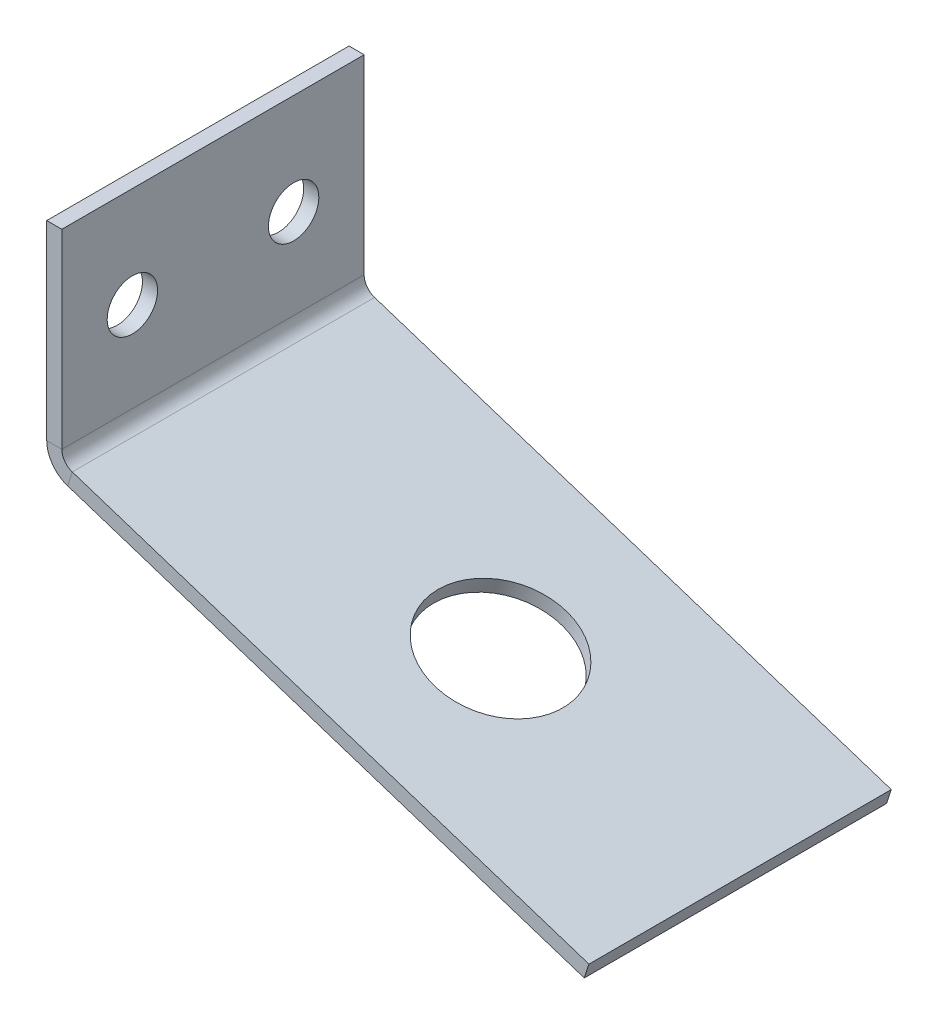
ISO-10303-21;
HEADER;
FILE_DESCRIPTION(('STEP AP214'),'2;1');
FILE_NAME('part.step','',(''),(''),'','','');
FILE_SCHEMA(('AUTOMOTIVE_DESIGN { 1 0 10303 214 1 1 1 1 }'));
ENDSEC;
DATA;
#1=APPLICATION_CONTEXT('core data for automotive mechanical design processes');
#2=APPLICATION_PROTOCOL_DEFINITION('international standard','automotive_design',2000,#1);
#3=PRODUCT_CONTEXT('',#1,'mechanical');
#4=PRODUCT('Part','Part','',(#3));
#5=PRODUCT_RELATED_PRODUCT_CATEGORY('part','',(#4));
#6=PRODUCT_DEFINITION_FORMATION('','',#4);
#7=PRODUCT_DEFINITION_CONTEXT('part definition',#1,'design');
#8=PRODUCT_DEFINITION('design','',#6,#7);
#9=PRODUCT_DEFINITION_SHAPE('','',#8);
#10=(LENGTH_UNIT() NAMED_UNIT(*) SI_UNIT(.MILLI.,.METRE.));
#11=(NAMED_UNIT(*) PLANE_ANGLE_UNIT() SI_UNIT($,.RADIAN.));
#12=(NAMED_UNIT(*) SI_UNIT($,.STERADIAN.) SOLID_ANGLE_UNIT());
#13=UNCERTAINTY_MEASURE_WITH_UNIT(LENGTH_MEASURE(1.E-05),#10,'distance_accuracy_value','');
#14=(GEOMETRIC_REPRESENTATION_CONTEXT(3) GLOBAL_UNCERTAINTY_ASSIGNED_CONTEXT((#13)) GLOBAL_UNIT_ASSIGNED_CONTEXT((#10,
#11,#12)) REPRESENTATION_CONTEXT('',''));
#15=CARTESIAN_POINT('',(0.,0.,0.));
#16=DIRECTION('',(0.,0.,1.));
#17=DIRECTION('',(1.,0.,0.));
#18=AXIS2_PLACEMENT_3D('',#15,#16,#17);
#19=CARTESIAN_POINT('',(1.03647450843758,-0.336770982434687,15.));
#20=DIRECTION('',(0.,0.,1.));
#21=DIRECTION('',(1.,0.,0.));
#22=AXIS2_PLACEMENT_3D('',#19,#20,#21);
#23=PLANE('',#22);
#24=DIRECTION('',(-0.309016994374944,-0.951056516295155,0.));
#25=VECTOR('',#24,1.);
#26=CARTESIAN_POINT('',(1.03647450843758,-0.336770982434687,15.));
#27=LINE('',#26,#25);
#28=CARTESIAN_POINT('',(1.03647450843758,-0.336770982434687,15.));
#29=VERTEX_POINT('',#28);
#30=CARTESIAN_POINT('',(0.572949016875167,-1.76335575687742,15.));
#31=VERTEX_POINT('',#30);
#32=EDGE_CURVE('E11',#29,#31,#27,.T.);
#33=ORIENTED_EDGE('',*,*,#32,.F.);
#34=CARTESIAN_POINT('',(1.5,1.08981379200804,15.));
#35=DIRECTION('',(0.,0.,-1.));
#36=DIRECTION('',(-1.,0.,0.));
#37=AXIS2_PLACEMENT_3D('',#34,#35,#36);
#38=CIRCLE('',#37,1.5);
#39=CARTESIAN_POINT('',(0.,1.08981379200804,15.));
#40=VERTEX_POINT('',#39);
#41=EDGE_CURVE('E142',#40,#29,#38,.F.);
#42=ORIENTED_EDGE('',*,*,#41,.F.);
#43=DIRECTION('',(1.,0.,0.));
#44=VECTOR('',#43,1.);
#45=CARTESIAN_POINT('',(-1.5,1.08981379200804,15.));
#46=LINE('',#45,#44);
#47=CARTESIAN_POINT('',(-1.5,1.08981379200804,15.));
#48=VERTEX_POINT('',#47);
#49=EDGE_CURVE('E53',#48,#40,#46,.T.);
#50=ORIENTED_EDGE('',*,*,#49,.F.);
#51=CARTESIAN_POINT('',(1.5,1.08981379200804,15.));
#52=DIRECTION('',(0.,0.,1.));
#53=DIRECTION('',(1.,0.,0.));
#54=AXIS2_PLACEMENT_3D('',#51,#52,#53);
#55=CIRCLE('',#54,3.);
#56=EDGE_CURVE('E135',#48,#31,#55,.T.);
#57=ORIENTED_EDGE('',*,*,#56,.T.);
#58=EDGE_LOOP('',(#33,#42,#50,#57));
#59=FACE_BOUND('',#58,.T.);
#60=ADVANCED_FACE('F45',(#59),#23,.T.);
#61=CARTESIAN_POINT('',(-1.5,1.08981379200804,15.));
#62=DIRECTION('',(0.,0.,1.));
#63=DIRECTION('',(1.,0.,0.));
#64=AXIS2_PLACEMENT_3D('',#61,#62,#63);
#65=PLANE('',#64);
#66=DIRECTION('',(0.951056516295155,-0.309016994374945,0.));
#67=VECTOR('',#66,1.);
#68=CARTESIAN_POINT('',(0.,0.,15.));
#69=LINE('',#68,#67);
#70=CARTESIAN_POINT('',(52.3081083962335,-16.995934690622,15.));
#71=VERTEX_POINT('',#70);
#72=EDGE_CURVE('E192',#29,#71,#69,.T.);
#73=ORIENTED_EDGE('',*,*,#72,.F.);
#74=ORIENTED_EDGE('',*,*,#32,.T.);
#75=DIRECTION('',(0.951056516295155,-0.309016994374945,0.));
#76=VECTOR('',#75,1.);
#77=CARTESIAN_POINT('',(-0.463525491562417,-1.42658477444273,15.));
#78=LINE('',#77,#76);
#79=CARTESIAN_POINT('',(51.8445829046711,-18.4225194650647,15.));
#80=VERTEX_POINT('',#79);
#81=EDGE_CURVE('E101',#31,#80,#78,.T.);
#82=ORIENTED_EDGE('',*,*,#81,.T.);
#83=DIRECTION('',(-0.309016994374934,-0.951056516295158,0.));
#84=VECTOR('',#83,1.);
#85=CARTESIAN_POINT('',(52.3081083962335,-16.995934690622,15.));
#86=LINE('',#85,#84);
#87=EDGE_CURVE('E406',#71,#80,#86,.T.);
#88=ORIENTED_EDGE('',*,*,#87,.F.);
#89=EDGE_LOOP('',(#73,#74,#82,#88));
#90=FACE_BOUND('',#89,.T.);
#91=ADVANCED_FACE('F200',(#90),#65,.T.);
#92=CARTESIAN_POINT('',(0.,1.08981379200804,-15.));
#93=DIRECTION('',(0.,0.,-1.));
#94=DIRECTION('',(-1.,0.,0.));
#95=AXIS2_PLACEMENT_3D('',#92,#93,#94);
#96=PLANE('',#95);
#97=DIRECTION('',(-1.,0.,0.));
#98=VECTOR('',#97,1.);
#99=CARTESIAN_POINT('',(0.,1.08981379200804,-15.));
#100=LINE('',#99,#98);
#101=CARTESIAN_POINT('',(0.,1.08981379200804,-15.));
#102=VERTEX_POINT('',#101);
#103=CARTESIAN_POINT('',(-1.5,1.08981379200804,-15.));
#104=VERTEX_POINT('',#103);
#105=EDGE_CURVE('E88',#102,#104,#100,.T.);
#106=ORIENTED_EDGE('',*,*,#105,.F.);
#107=CARTESIAN_POINT('',(1.5,1.08981379200804,-15.));
#108=DIRECTION('',(0.,0.,-1.));
#109=DIRECTION('',(-1.,0.,0.));
#110=AXIS2_PLACEMENT_3D('',#107,#108,#109);
#111=CIRCLE('',#110,1.5);
#112=CARTESIAN_POINT('',(1.03647450843758,-0.336770982434687,-15.));
#113=VERTEX_POINT('',#112);
#114=EDGE_CURVE('E158',#102,#113,#111,.F.);
#115=ORIENTED_EDGE('',*,*,#114,.T.);
#116=DIRECTION('',(0.309016994374944,0.951056516295155,0.));
#117=VECTOR('',#116,1.);
#118=CARTESIAN_POINT('',(0.572949016875167,-1.76335575687742,-15.));
#119=LINE('',#118,#117);
#120=CARTESIAN_POINT('',(0.572949016875167,-1.76335575687742,-15.));
#121=VERTEX_POINT('',#120);
#122=EDGE_CURVE('E95',#121,#113,#119,.T.);
#123=ORIENTED_EDGE('',*,*,#122,.F.);
#124=CARTESIAN_POINT('',(1.5,1.08981379200804,-15.));
#125=DIRECTION('',(0.,0.,1.));
#126=DIRECTION('',(1.,0.,0.));
#127=AXIS2_PLACEMENT_3D('',#124,#125,#126);
#128=CIRCLE('',#127,3.);
#129=EDGE_CURVE('E165',#104,#121,#128,.T.);
#130=ORIENTED_EDGE('',*,*,#129,.F.);
#131=EDGE_LOOP('',(#106,#115,#123,#130));
#132=FACE_BOUND('',#131,.T.);
#133=ADVANCED_FACE('F198',(#132),#96,.T.);
#134=CARTESIAN_POINT('',(0.572949016875167,-1.76335575687742,-15.));
#135=DIRECTION('',(0.,0.,-1.));
#136=DIRECTION('',(-1.,0.,0.));
#137=AXIS2_PLACEMENT_3D('',#134,#135,#136);
#138=PLANE('',#137);
#139=DIRECTION('',(0.,-1.,0.));
#140=VECTOR('',#139,1.);
#141=CARTESIAN_POINT('',(0.,20.,-15.));
#142=LINE('',#141,#140);
#143=CARTESIAN_POINT('',(0.,20.,-15.));
#144=VERTEX_POINT('',#143);
#145=EDGE_CURVE('E160',#144,#102,#142,.T.);
#146=ORIENTED_EDGE('',*,*,#145,.T.);
#147=ORIENTED_EDGE('',*,*,#105,.T.);
#148=DIRECTION('',(0.,-1.,0.));
#149=VECTOR('',#148,1.);
#150=CARTESIAN_POINT('',(-1.5,20.,-15.));
#151=LINE('',#150,#149);
#152=CARTESIAN_POINT('',(-1.5,20.,-15.));
#153=VERTEX_POINT('',#152);
#154=EDGE_CURVE('E163',#153,#104,#151,.T.);
#155=ORIENTED_EDGE('',*,*,#154,.F.);
#156=DIRECTION('',(1.,0.,0.));
#157=VECTOR('',#156,1.);
#158=CARTESIAN_POINT('',(-1.5,20.,-15.));
#159=LINE('',#158,#157);
#160=EDGE_CURVE('E123',#153,#144,#159,.T.);
#161=ORIENTED_EDGE('',*,*,#160,.T.);
#162=EDGE_LOOP('',(#146,#147,#155,#161));
#163=FACE_BOUND('',#162,.T.);
#164=ADVANCED_FACE('F194',(#163),#138,.T.);
#165=CARTESIAN_POINT('',(-0.463525491562417,-1.42658477444273,15.));
#166=DIRECTION('',(0.309016994374945,0.951056516295154,0.));
#167=DIRECTION('',(-0.951056516295155,0.309016994374945,0.));
#168=AXIS2_PLACEMENT_3D('',#165,#166,#167);
#169=PLANE('',#168);
#170=CARTESIAN_POINT('',(28.0681699972922,-10.6970946056911,0.));
#171=DIRECTION('',(0.309016994374945,0.951056516295155,0.));
#172=DIRECTION('',(-0.951056516295155,0.309016994374945,0.));
#173=AXIS2_PLACEMENT_3D('',#170,#171,#172);
#174=CIRCLE('',#173,6.5);
#175=CARTESIAN_POINT('',(21.8863026413737,-8.68848414225393,0.));
#176=VERTEX_POINT('',#175);
#177=EDGE_CURVE('E387',#176,#176,#174,.T.);
#178=ORIENTED_EDGE('',*,*,#177,.T.);
#179=EDGE_LOOP('',(#178));
#180=FACE_BOUND('',#179,.T.);
#181=DIRECTION('',(0.951056516295155,-0.309016994374945,0.));
#182=VECTOR('',#181,1.);
#183=CARTESIAN_POINT('',(-0.463525491562417,-1.42658477444273,-15.));
#184=LINE('',#183,#182);
#185=CARTESIAN_POINT('',(51.8445829046711,-18.4225194650647,-15.));
#186=VERTEX_POINT('',#185);
#187=EDGE_CURVE('E148',#121,#186,#184,.T.);
#188=ORIENTED_EDGE('',*,*,#187,.T.);
#189=DIRECTION('',(0.,0.,-1.));
#190=VECTOR('',#189,1.);
#191=CARTESIAN_POINT('',(51.8445829046711,-18.4225194650647,15.));
#192=LINE('',#191,#190);
#193=EDGE_CURVE('E179',#80,#186,#192,.T.);
#194=ORIENTED_EDGE('',*,*,#193,.F.);
#195=ORIENTED_EDGE('',*,*,#81,.F.);
#196=DIRECTION('',(0.,0.,-1.));
#197=VECTOR('',#196,1.);
#198=CARTESIAN_POINT('',(0.572949016875167,-1.76335575687742,15.));
#199=LINE('',#198,#197);
#200=EDGE_CURVE('E147',#31,#121,#199,.T.);
#201=ORIENTED_EDGE('',*,*,#200,.T.);
#202=EDGE_LOOP('',(#188,#194,#195,#201));
#203=FACE_BOUND('',#202,.T.);
#204=ADVANCED_FACE('F206',(#180,#203),#169,.F.);
#205=CARTESIAN_POINT('',(52.3081083962335,-16.995934690622,15.));
#206=DIRECTION('',(0.951056516295158,-0.309016994374934,0.));
#207=DIRECTION('',(0.309016994374934,0.951056516295158,0.));
#208=AXIS2_PLACEMENT_3D('',#205,#206,#207);
#209=PLANE('',#208);
#210=DIRECTION('',(-0.309016994374934,-0.951056516295158,0.));
#211=VECTOR('',#210,1.);
#212=CARTESIAN_POINT('',(52.3081083962335,-16.995934690622,-15.));
#213=LINE('',#212,#211);
#214=CARTESIAN_POINT('',(52.3081083962335,-16.995934690622,-15.));
#215=VERTEX_POINT('',#214);
#216=EDGE_CURVE('E151',#215,#186,#213,.T.);
#217=ORIENTED_EDGE('',*,*,#216,.F.);
#218=DIRECTION('',(0.,0.,-1.));
#219=VECTOR('',#218,1.);
#220=CARTESIAN_POINT('',(52.3081083962335,-16.995934690622,15.));
#221=LINE('',#220,#219);
#222=EDGE_CURVE('E177',#71,#215,#221,.T.);
#223=ORIENTED_EDGE('',*,*,#222,.F.);
#224=ORIENTED_EDGE('',*,*,#87,.T.);
#225=ORIENTED_EDGE('',*,*,#193,.T.);
#226=EDGE_LOOP('',(#217,#223,#224,#225));
#227=FACE_BOUND('',#226,.T.);
#228=ADVANCED_FACE('F240',(#227),#209,.T.);
#229=CARTESIAN_POINT('',(0.,0.,15.));
#230=DIRECTION('',(0.309016994374945,0.951056516295155,0.));
#231=DIRECTION('',(-0.951056516295155,0.309016994374945,0.));
#232=AXIS2_PLACEMENT_3D('',#229,#230,#231);
#233=PLANE('',#232);
#234=CARTESIAN_POINT('',(28.5316954888546,-9.27050983124834,0.));
#235=DIRECTION('',(0.309016994374945,0.951056516295155,0.));
#236=DIRECTION('',(-0.951056516295155,0.309016994374945,0.));
#237=AXIS2_PLACEMENT_3D('',#234,#235,#236);
#238=CIRCLE('',#237,6.5);
#239=CARTESIAN_POINT('',(22.3498281329361,-7.2618993678112,0.));
#240=VERTEX_POINT('',#239);
#241=EDGE_CURVE('E390',#240,#240,#238,.T.);
#242=ORIENTED_EDGE('',*,*,#241,.F.);
#243=EDGE_LOOP('',(#242));
#244=FACE_BOUND('',#243,.T.);
#245=DIRECTION('',(0.951056516295155,-0.309016994374945,0.));
#246=VECTOR('',#245,1.);
#247=CARTESIAN_POINT('',(0.,0.,-15.));
#248=LINE('',#247,#246);
#249=EDGE_CURVE('E155',#113,#215,#248,.T.);
#250=ORIENTED_EDGE('',*,*,#249,.F.);
#251=DIRECTION('',(0.,0.,-1.));
#252=VECTOR('',#251,1.);
#253=CARTESIAN_POINT('',(1.03647450843758,-0.336770982434687,15.));
#254=LINE('',#253,#252);
#255=EDGE_CURVE('E174',#29,#113,#254,.T.);
#256=ORIENTED_EDGE('',*,*,#255,.F.);
#257=ORIENTED_EDGE('',*,*,#72,.T.);
#258=ORIENTED_EDGE('',*,*,#222,.T.);
#259=EDGE_LOOP('',(#250,#256,#257,#258));
#260=FACE_BOUND('',#259,.T.);
#261=ADVANCED_FACE('F252',(#244,#260),#233,.T.);
#262=CARTESIAN_POINT('',(1.5,1.08981379200804,15.));
#263=DIRECTION('',(0.,0.,-1.));
#264=DIRECTION('',(-1.,0.,0.));
#265=AXIS2_PLACEMENT_3D('',#262,#263,#264);
#266=CYLINDRICAL_SURFACE('',#265,1.5);
#267=ORIENTED_EDGE('',*,*,#114,.F.);
#268=DIRECTION('',(0.,0.,-1.));
#269=VECTOR('',#268,1.);
#270=CARTESIAN_POINT('',(0.,1.08981379200804,15.));
#271=LINE('',#270,#269);
#272=EDGE_CURVE('E171',#40,#102,#271,.T.);
#273=ORIENTED_EDGE('',*,*,#272,.F.);
#274=ORIENTED_EDGE('',*,*,#41,.T.);
#275=ORIENTED_EDGE('',*,*,#255,.T.);
#276=EDGE_LOOP('',(#267,#273,#274,#275));
#277=FACE_BOUND('',#276,.T.);
#278=ADVANCED_FACE('F188',(#277),#266,.F.);
#279=CARTESIAN_POINT('',(0.,20.,15.));
#280=DIRECTION('',(1.,0.,0.));
#281=DIRECTION('',(0.,1.,0.));
#282=AXIS2_PLACEMENT_3D('',#279,#280,#281);
#283=PLANE('',#282);
#284=CARTESIAN_POINT('',(0.,10.,8.));
#285=DIRECTION('',(1.,0.,0.));
#286=DIRECTION('',(0.,1.,0.));
#287=AXIS2_PLACEMENT_3D('',#284,#285,#286);
#288=CIRCLE('',#287,2.5);
#289=CARTESIAN_POINT('',(0.,12.5,8.));
#290=VERTEX_POINT('',#289);
#291=EDGE_CURVE('E397',#290,#290,#288,.T.);
#292=ORIENTED_EDGE('',*,*,#291,.F.);
#293=EDGE_LOOP('',(#292));
#294=FACE_BOUND('',#293,.T.);
#295=CARTESIAN_POINT('',(0.,10.,-8.));
#296=DIRECTION('',(1.,0.,0.));
#297=DIRECTION('',(0.,1.,0.));
#298=AXIS2_PLACEMENT_3D('',#295,#296,#297);
#299=CIRCLE('',#298,2.5);
#300=CARTESIAN_POINT('',(0.,12.5,-8.));
#301=VERTEX_POINT('',#300);
#302=EDGE_CURVE('E392',#301,#301,#299,.T.);
#303=ORIENTED_EDGE('',*,*,#302,.F.);
#304=EDGE_LOOP('',(#303));
#305=FACE_BOUND('',#304,.T.);
#306=ORIENTED_EDGE('',*,*,#145,.F.);
#307=DIRECTION('',(0.,0.,-1.));
#308=VECTOR('',#307,1.);
#309=CARTESIAN_POINT('',(0.,20.,15.));
#310=LINE('',#309,#308);
#311=CARTESIAN_POINT('',(0.,20.,15.));
#312=VERTEX_POINT('',#311);
#313=EDGE_CURVE('E125',#312,#144,#310,.T.);
#314=ORIENTED_EDGE('',*,*,#313,.F.);
#315=DIRECTION('',(0.,-1.,0.));
#316=VECTOR('',#315,1.);
#317=CARTESIAN_POINT('',(0.,20.,15.));
#318=LINE('',#317,#316);
#319=EDGE_CURVE('E140',#312,#40,#318,.T.);
#320=ORIENTED_EDGE('',*,*,#319,.T.);
#321=ORIENTED_EDGE('',*,*,#272,.T.);
#322=EDGE_LOOP('',(#306,#314,#320,#321));
#323=FACE_BOUND('',#322,.T.);
#324=ADVANCED_FACE('F193',(#294,#305,#323),#283,.T.);
#325=CARTESIAN_POINT('',(-1.5,20.,15.));
#326=DIRECTION('',(0.,1.,0.));
#327=DIRECTION('',(0.,0.,1.));
#328=AXIS2_PLACEMENT_3D('',#325,#326,#327);
#329=PLANE('',#328);
#330=ORIENTED_EDGE('',*,*,#160,.F.);
#331=DIRECTION('',(0.,0.,-1.));
#332=VECTOR('',#331,1.);
#333=CARTESIAN_POINT('',(-1.5,20.,15.));
#334=LINE('',#333,#332);
#335=CARTESIAN_POINT('',(-1.5,20.,15.));
#336=VERTEX_POINT('',#335);
#337=EDGE_CURVE('E117',#336,#153,#334,.T.);
#338=ORIENTED_EDGE('',*,*,#337,.F.);
#339=DIRECTION('',(1.,0.,0.));
#340=VECTOR('',#339,1.);
#341=CARTESIAN_POINT('',(-1.5,20.,15.));
#342=LINE('',#341,#340);
#343=EDGE_CURVE('E121',#336,#312,#342,.T.);
#344=ORIENTED_EDGE('',*,*,#343,.T.);
#345=ORIENTED_EDGE('',*,*,#313,.T.);
#346=EDGE_LOOP('',(#330,#338,#344,#345));
#347=FACE_BOUND('',#346,.T.);
#348=ADVANCED_FACE('F119',(#347),#329,.T.);
#349=CARTESIAN_POINT('',(-1.5,20.,15.));
#350=DIRECTION('',(1.,0.,0.));
#351=DIRECTION('',(0.,1.,0.));
#352=AXIS2_PLACEMENT_3D('',#349,#350,#351);
#353=PLANE('',#352);
#354=CARTESIAN_POINT('',(-1.5,10.,8.));
#355=DIRECTION('',(1.,0.,0.));
#356=DIRECTION('',(0.,1.,0.));
#357=AXIS2_PLACEMENT_3D('',#354,#355,#356);
#358=CIRCLE('',#357,2.5);
#359=CARTESIAN_POINT('',(-1.5,12.5,8.));
#360=VERTEX_POINT('',#359);
#361=EDGE_CURVE('E152',#360,#360,#358,.T.);
#362=ORIENTED_EDGE('',*,*,#361,.T.);
#363=EDGE_LOOP('',(#362));
#364=FACE_BOUND('',#363,.T.);
#365=CARTESIAN_POINT('',(-1.5,10.,-8.));
#366=DIRECTION('',(1.,0.,0.));
#367=DIRECTION('',(0.,1.,0.));
#368=AXIS2_PLACEMENT_3D('',#365,#366,#367);
#369=CIRCLE('',#368,2.5);
#370=CARTESIAN_POINT('',(-1.5,12.5,-8.));
#371=VERTEX_POINT('',#370);
#372=EDGE_CURVE('E400',#371,#371,#369,.T.);
#373=ORIENTED_EDGE('',*,*,#372,.T.);
#374=EDGE_LOOP('',(#373));
#375=FACE_BOUND('',#374,.T.);
#376=ORIENTED_EDGE('',*,*,#154,.T.);
#377=DIRECTION('',(0.,0.,-1.));
#378=VECTOR('',#377,1.);
#379=CARTESIAN_POINT('',(-1.5,1.08981379200804,15.));
#380=LINE('',#379,#378);
#381=EDGE_CURVE('E126',#48,#104,#380,.T.);
#382=ORIENTED_EDGE('',*,*,#381,.F.);
#383=DIRECTION('',(0.,-1.,0.));
#384=VECTOR('',#383,1.);
#385=CARTESIAN_POINT('',(-1.5,20.,15.));
#386=LINE('',#385,#384);
#387=EDGE_CURVE('E130',#336,#48,#386,.T.);
#388=ORIENTED_EDGE('',*,*,#387,.F.);
#389=ORIENTED_EDGE('',*,*,#337,.T.);
#390=EDGE_LOOP('',(#376,#382,#388,#389));
#391=FACE_BOUND('',#390,.T.);
#392=ADVANCED_FACE('F131',(#364,#375,#391),#353,.F.);
#393=CARTESIAN_POINT('',(1.5,1.08981379200804,15.));
#394=DIRECTION('',(0.,0.,-1.));
#395=DIRECTION('',(-1.,0.,0.));
#396=AXIS2_PLACEMENT_3D('',#393,#394,#395);
#397=CYLINDRICAL_SURFACE('',#396,3.);
#398=ORIENTED_EDGE('',*,*,#129,.T.);
#399=ORIENTED_EDGE('',*,*,#200,.F.);
#400=ORIENTED_EDGE('',*,*,#56,.F.);
#401=ORIENTED_EDGE('',*,*,#381,.T.);
#402=EDGE_LOOP('',(#398,#399,#400,#401));
#403=FACE_BOUND('',#402,.T.);
#404=ADVANCED_FACE('F196',(#403),#397,.T.);
#405=CARTESIAN_POINT('',(1.5,1.08981379200804,15.));
#406=DIRECTION('',(0.,0.,-1.));
#407=DIRECTION('',(-1.,0.,0.));
#408=AXIS2_PLACEMENT_3D('',#405,#406,#407);
#409=PLANE('',#408);
#410=ORIENTED_EDGE('',*,*,#387,.T.);
#411=ORIENTED_EDGE('',*,*,#49,.T.);
#412=ORIENTED_EDGE('',*,*,#319,.F.);
#413=ORIENTED_EDGE('',*,*,#343,.F.);
#414=EDGE_LOOP('',(#410,#411,#412,#413));
#415=FACE_BOUND('',#414,.T.);
#416=ADVANCED_FACE('F138',(#415),#409,.F.);
#417=CARTESIAN_POINT('',(1.5,1.08981379200804,-15.));
#418=DIRECTION('',(0.,0.,-1.));
#419=DIRECTION('',(-1.,0.,0.));
#420=AXIS2_PLACEMENT_3D('',#417,#418,#419);
#421=PLANE('',#420);
#422=ORIENTED_EDGE('',*,*,#187,.F.);
#423=ORIENTED_EDGE('',*,*,#122,.T.);
#424=ORIENTED_EDGE('',*,*,#249,.T.);
#425=ORIENTED_EDGE('',*,*,#216,.T.);
#426=EDGE_LOOP('',(#422,#423,#424,#425));
#427=FACE_BOUND('',#426,.T.);
#428=ADVANCED_FACE('F322',(#427),#421,.T.);
#429=CARTESIAN_POINT('',(-1.5,10.,-8.));
#430=DIRECTION('',(1.,0.,0.));
#431=DIRECTION('',(0.,1.,0.));
#432=AXIS2_PLACEMENT_3D('',#429,#430,#431);
#433=CYLINDRICAL_SURFACE('',#432,2.5);
#434=ORIENTED_EDGE('',*,*,#372,.F.);
#435=EDGE_LOOP('',(#434));
#436=FACE_BOUND('',#435,.T.);
#437=ORIENTED_EDGE('',*,*,#302,.T.);
#438=EDGE_LOOP('',(#437));
#439=FACE_BOUND('',#438,.T.);
#440=ADVANCED_FACE('F331',(#436,#439),#433,.F.);
#441=CARTESIAN_POINT('',(-1.5,10.,8.));
#442=DIRECTION('',(1.,0.,0.));
#443=DIRECTION('',(0.,1.,0.));
#444=AXIS2_PLACEMENT_3D('',#441,#442,#443);
#445=CYLINDRICAL_SURFACE('',#444,2.5);
#446=ORIENTED_EDGE('',*,*,#361,.F.);
#447=EDGE_LOOP('',(#446));
#448=FACE_BOUND('',#447,.T.);
#449=ORIENTED_EDGE('',*,*,#291,.T.);
#450=EDGE_LOOP('',(#449));
#451=FACE_BOUND('',#450,.T.);
#452=ADVANCED_FACE('F341',(#448,#451),#445,.F.);
#453=CARTESIAN_POINT('',(28.0681699972922,-10.6970946056911,0.));
#454=DIRECTION('',(0.309016994374945,0.951056516295154,0.));
#455=DIRECTION('',(-0.951056516295155,0.309016994374945,0.));
#456=AXIS2_PLACEMENT_3D('',#453,#454,#455);
#457=CYLINDRICAL_SURFACE('',#456,6.5);
#458=ORIENTED_EDGE('',*,*,#177,.F.);
#459=EDGE_LOOP('',(#458));
#460=FACE_BOUND('',#459,.T.);
#461=ORIENTED_EDGE('',*,*,#241,.T.);
#462=EDGE_LOOP('',(#461));
#463=FACE_BOUND('',#462,.T.);
#464=ADVANCED_FACE('F351',(#460,#463),#457,.F.);
#465=CLOSED_SHELL('',(#60,#91,#133,#164,#204,#228,#261,#278,#324,#348,#392,#404,#416,#428,#440,
#452,#464));
#466=MANIFOLD_SOLID_BREP('B2',#465);
#467=ADVANCED_BREP_SHAPE_REPRESENTATION('',(#18,#466),#14);
#468=SHAPE_DEFINITION_REPRESENTATION(#9,#467);
ENDSEC;
END-ISO-10303-21;
